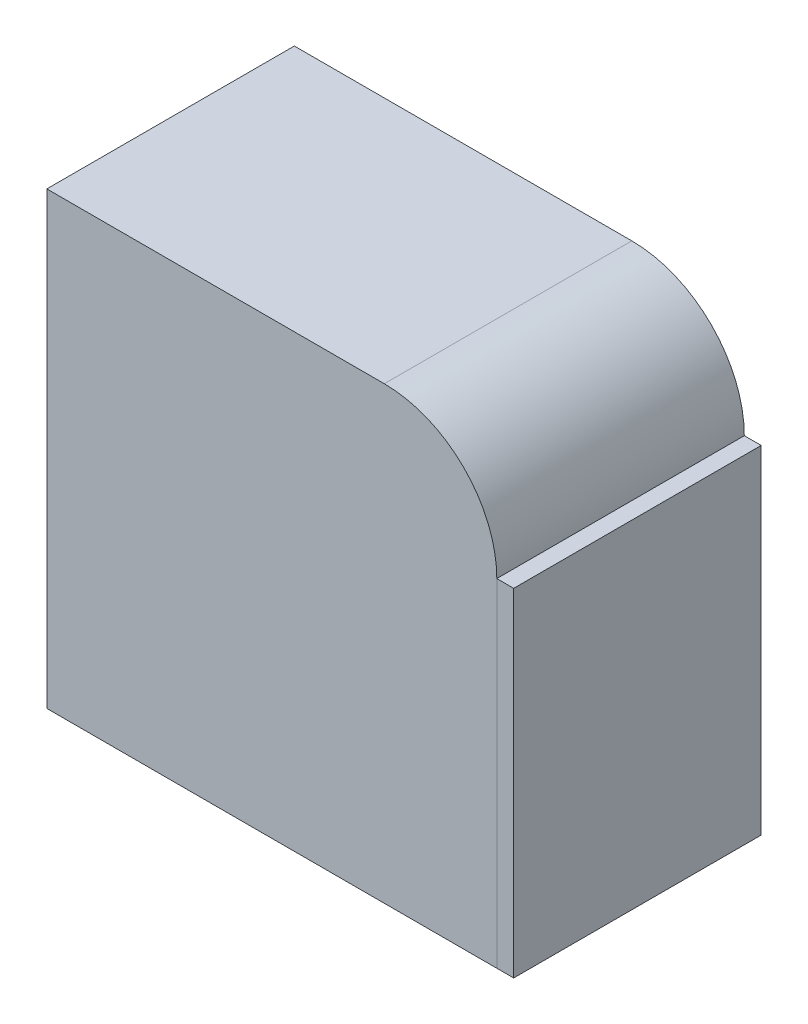
ISO-10303-21;
HEADER;
FILE_DESCRIPTION(('STEP AP214'),'2;1');
FILE_NAME('part.step','',(''),(''),'','','');
FILE_SCHEMA(('AUTOMOTIVE_DESIGN { 1 0 10303 214 1 1 1 1 }'));
ENDSEC;
DATA;
#1=APPLICATION_CONTEXT('core data for automotive mechanical design processes');
#2=APPLICATION_PROTOCOL_DEFINITION('international standard','automotive_design',2000,#1);
#3=PRODUCT_CONTEXT('',#1,'mechanical');
#4=PRODUCT('Part','Part','',(#3));
#5=PRODUCT_RELATED_PRODUCT_CATEGORY('part','',(#4));
#6=PRODUCT_DEFINITION_FORMATION('','',#4);
#7=PRODUCT_DEFINITION_CONTEXT('part definition',#1,'design');
#8=PRODUCT_DEFINITION('design','',#6,#7);
#9=PRODUCT_DEFINITION_SHAPE('','',#8);
#10=(LENGTH_UNIT() NAMED_UNIT(*) SI_UNIT(.MILLI.,.METRE.));
#11=(NAMED_UNIT(*) PLANE_ANGLE_UNIT() SI_UNIT($,.RADIAN.));
#12=(NAMED_UNIT(*) SI_UNIT($,.STERADIAN.) SOLID_ANGLE_UNIT());
#13=UNCERTAINTY_MEASURE_WITH_UNIT(LENGTH_MEASURE(1.E-05),#10,'distance_accuracy_value','');
#14=(GEOMETRIC_REPRESENTATION_CONTEXT(3) GLOBAL_UNCERTAINTY_ASSIGNED_CONTEXT((#13)) GLOBAL_UNIT_ASSIGNED_CONTEXT((#10,
#11,#12)) REPRESENTATION_CONTEXT('',''));
#15=CARTESIAN_POINT('',(0.,0.,0.));
#16=DIRECTION('',(0.,0.,1.));
#17=DIRECTION('',(1.,0.,0.));
#18=AXIS2_PLACEMENT_3D('',#15,#16,#17);
#19=CARTESIAN_POINT('',(-16.5,-55.,11.));
#20=DIRECTION('',(0.,1.,0.));
#21=DIRECTION('',(0.,0.,1.));
#22=AXIS2_PLACEMENT_3D('',#19,#20,#21);
#23=PLANE('',#22);
#24=DIRECTION('',(0.,0.,-1.));
#25=VECTOR('',#24,1.);
#26=CARTESIAN_POINT('',(-18.,-55.,11.));
#27=LINE('',#26,#25);
#28=CARTESIAN_POINT('',(-18.,-55.,11.));
#29=VERTEX_POINT('',#28);
#30=CARTESIAN_POINT('',(-18.,-55.,-11.));
#31=VERTEX_POINT('',#30);
#32=EDGE_CURVE('E112',#29,#31,#27,.T.);
#33=ORIENTED_EDGE('',*,*,#32,.T.);
#34=DIRECTION('',(-1.,0.,0.));
#35=VECTOR('',#34,1.);
#36=CARTESIAN_POINT('',(-16.5,-55.,-11.));
#37=LINE('',#36,#35);
#38=CARTESIAN_POINT('',(-16.5,-55.,-11.));
#39=VERTEX_POINT('',#38);
#40=EDGE_CURVE('E12',#39,#31,#37,.T.);
#41=ORIENTED_EDGE('',*,*,#40,.F.);
#42=DIRECTION('',(0.,0.,-1.));
#43=VECTOR('',#42,1.);
#44=CARTESIAN_POINT('',(-16.5,-55.,11.));
#45=LINE('',#44,#43);
#46=CARTESIAN_POINT('',(-16.5,-55.,11.));
#47=VERTEX_POINT('',#46);
#48=EDGE_CURVE('E100',#47,#39,#45,.T.);
#49=ORIENTED_EDGE('',*,*,#48,.F.);
#50=DIRECTION('',(-1.,0.,0.));
#51=VECTOR('',#50,1.);
#52=CARTESIAN_POINT('',(-16.5,-55.,11.));
#53=LINE('',#52,#51);
#54=EDGE_CURVE('E108',#47,#29,#53,.T.);
#55=ORIENTED_EDGE('',*,*,#54,.T.);
#56=EDGE_LOOP('',(#33,#41,#49,#55));
#57=FACE_BOUND('',#56,.T.);
#58=ADVANCED_FACE('F49',(#57),#23,.F.);
#59=CARTESIAN_POINT('',(-16.5,-55.,-11.));
#60=DIRECTION('',(0.,0.,1.));
#61=DIRECTION('',(1.,0.,0.));
#62=AXIS2_PLACEMENT_3D('',#59,#60,#61);
#63=PLANE('',#62);
#64=DIRECTION('',(0.,1.,0.));
#65=VECTOR('',#64,1.);
#66=CARTESIAN_POINT('',(-18.,-55.,-11.));
#67=LINE('',#66,#65);
#68=CARTESIAN_POINT('',(-18.,-25.,-11.));
#69=VERTEX_POINT('',#68);
#70=EDGE_CURVE('E104',#31,#69,#67,.T.);
#71=ORIENTED_EDGE('',*,*,#70,.T.);
#72=DIRECTION('',(-1.,0.,0.));
#73=VECTOR('',#72,1.);
#74=CARTESIAN_POINT('',(-16.5,-25.,-11.));
#75=LINE('',#74,#73);
#76=CARTESIAN_POINT('',(-16.5,-25.,-11.));
#77=VERTEX_POINT('',#76);
#78=EDGE_CURVE('E57',#77,#69,#75,.T.);
#79=ORIENTED_EDGE('',*,*,#78,.F.);
#80=DIRECTION('',(0.,1.,0.));
#81=VECTOR('',#80,1.);
#82=CARTESIAN_POINT('',(-16.5,-55.,-11.));
#83=LINE('',#82,#81);
#84=EDGE_CURVE('E95',#39,#77,#83,.T.);
#85=ORIENTED_EDGE('',*,*,#84,.F.);
#86=ORIENTED_EDGE('',*,*,#40,.T.);
#87=EDGE_LOOP('',(#71,#79,#85,#86));
#88=FACE_BOUND('',#87,.T.);
#89=ADVANCED_FACE('F103',(#88),#63,.F.);
#90=CARTESIAN_POINT('',(-16.5,-25.,-11.));
#91=DIRECTION('',(0.,-1.,0.));
#92=DIRECTION('',(0.,0.,-1.));
#93=AXIS2_PLACEMENT_3D('',#90,#91,#92);
#94=PLANE('',#93);
#95=DIRECTION('',(0.,0.,1.));
#96=VECTOR('',#95,1.);
#97=CARTESIAN_POINT('',(-18.,-25.,-11.));
#98=LINE('',#97,#96);
#99=CARTESIAN_POINT('',(-18.,-25.,11.));
#100=VERTEX_POINT('',#99);
#101=EDGE_CURVE('E82',#69,#100,#98,.T.);
#102=ORIENTED_EDGE('',*,*,#101,.T.);
#103=DIRECTION('',(-1.,0.,0.));
#104=VECTOR('',#103,1.);
#105=CARTESIAN_POINT('',(-16.5,-25.,11.));
#106=LINE('',#105,#104);
#107=CARTESIAN_POINT('',(-16.5,-25.,11.));
#108=VERTEX_POINT('',#107);
#109=EDGE_CURVE('E105',#108,#100,#106,.T.);
#110=ORIENTED_EDGE('',*,*,#109,.F.);
#111=DIRECTION('',(0.,0.,1.));
#112=VECTOR('',#111,1.);
#113=CARTESIAN_POINT('',(-16.5,-25.,-11.));
#114=LINE('',#113,#112);
#115=EDGE_CURVE('E98',#77,#108,#114,.T.);
#116=ORIENTED_EDGE('',*,*,#115,.F.);
#117=ORIENTED_EDGE('',*,*,#78,.T.);
#118=EDGE_LOOP('',(#102,#110,#116,#117));
#119=FACE_BOUND('',#118,.T.);
#120=ADVANCED_FACE('F106',(#119),#94,.F.);
#121=CARTESIAN_POINT('',(-16.5,-25.,11.));
#122=DIRECTION('',(0.,0.,-1.));
#123=DIRECTION('',(-1.,0.,0.));
#124=AXIS2_PLACEMENT_3D('',#121,#122,#123);
#125=PLANE('',#124);
#126=DIRECTION('',(0.,-1.,0.));
#127=VECTOR('',#126,1.);
#128=CARTESIAN_POINT('',(-18.,-25.,11.));
#129=LINE('',#128,#127);
#130=EDGE_CURVE('E88',#100,#29,#129,.T.);
#131=ORIENTED_EDGE('',*,*,#130,.T.);
#132=ORIENTED_EDGE('',*,*,#54,.F.);
#133=DIRECTION('',(0.,-1.,0.));
#134=VECTOR('',#133,1.);
#135=CARTESIAN_POINT('',(-16.5,-25.,11.));
#136=LINE('',#135,#134);
#137=EDGE_CURVE('E65',#108,#47,#136,.T.);
#138=ORIENTED_EDGE('',*,*,#137,.F.);
#139=ORIENTED_EDGE('',*,*,#109,.T.);
#140=EDGE_LOOP('',(#131,#132,#138,#139));
#141=FACE_BOUND('',#140,.T.);
#142=ADVANCED_FACE('F119',(#141),#125,.F.);
#143=CARTESIAN_POINT('',(-16.5,0.,0.));
#144=DIRECTION('',(1.,0.,0.));
#145=DIRECTION('',(0.,0.,-1.));
#146=AXIS2_PLACEMENT_3D('',#143,#144,#145);
#147=PLANE('',#146);
#148=ORIENTED_EDGE('',*,*,#48,.T.);
#149=ORIENTED_EDGE('',*,*,#84,.T.);
#150=ORIENTED_EDGE('',*,*,#115,.T.);
#151=ORIENTED_EDGE('',*,*,#137,.T.);
#152=EDGE_LOOP('',(#148,#149,#150,#151));
#153=FACE_BOUND('',#152,.T.);
#154=ADVANCED_FACE('F96',(#153),#147,.T.);
#155=CARTESIAN_POINT('',(-18.,0.,0.));
#156=DIRECTION('',(1.,0.,0.));
#157=DIRECTION('',(0.,0.,-1.));
#158=AXIS2_PLACEMENT_3D('',#155,#156,#157);
#159=PLANE('',#158);
#160=ORIENTED_EDGE('',*,*,#32,.F.);
#161=ORIENTED_EDGE('',*,*,#130,.F.);
#162=ORIENTED_EDGE('',*,*,#101,.F.);
#163=ORIENTED_EDGE('',*,*,#70,.F.);
#164=EDGE_LOOP('',(#160,#161,#162,#163));
#165=FACE_BOUND('',#164,.T.);
#166=ADVANCED_FACE('F122',(#165),#159,.F.);
#167=CLOSED_SHELL('',(#58,#89,#120,#142,#154,#166));
#168=MANIFOLD_SOLID_BREP('B2',#167);
#169=CARTESIAN_POINT('',(-58.,-15.,11.));
#170=DIRECTION('',(1.,0.,0.));
#171=DIRECTION('',(0.,1.,0.));
#172=AXIS2_PLACEMENT_3D('',#169,#170,#171);
#173=PLANE('',#172);
#174=DIRECTION('',(0.,-1.,0.));
#175=VECTOR('',#174,1.);
#176=CARTESIAN_POINT('',(-58.,-15.,-11.));
#177=LINE('',#176,#175);
#178=CARTESIAN_POINT('',(-58.,-15.,-11.));
#179=VERTEX_POINT('',#178);
#180=CARTESIAN_POINT('',(-58.,-55.,-11.));
#181=VERTEX_POINT('',#180);
#182=EDGE_CURVE('E247',#179,#181,#177,.T.);
#183=ORIENTED_EDGE('',*,*,#182,.T.);
#184=DIRECTION('',(0.,0.,-1.));
#185=VECTOR('',#184,1.);
#186=CARTESIAN_POINT('',(-58.,-55.,11.));
#187=LINE('',#186,#185);
#188=CARTESIAN_POINT('',(-58.,-55.,11.));
#189=VERTEX_POINT('',#188);
#190=EDGE_CURVE('E47',#189,#181,#187,.T.);
#191=ORIENTED_EDGE('',*,*,#190,.F.);
#192=DIRECTION('',(0.,-1.,0.));
#193=VECTOR('',#192,1.);
#194=CARTESIAN_POINT('',(-58.,-15.,11.));
#195=LINE('',#194,#193);
#196=CARTESIAN_POINT('',(-58.,-15.,11.));
#197=VERTEX_POINT('',#196);
#198=EDGE_CURVE('E255',#197,#189,#195,.T.);
#199=ORIENTED_EDGE('',*,*,#198,.F.);
#200=DIRECTION('',(0.,0.,-1.));
#201=VECTOR('',#200,1.);
#202=CARTESIAN_POINT('',(-58.,-15.,11.));
#203=LINE('',#202,#201);
#204=EDGE_CURVE('E243',#197,#179,#203,.T.);
#205=ORIENTED_EDGE('',*,*,#204,.T.);
#206=EDGE_LOOP('',(#183,#191,#199,#205));
#207=FACE_BOUND('',#206,.T.);
#208=ADVANCED_FACE('F173',(#207),#173,.F.);
#209=CARTESIAN_POINT('',(-58.,-55.,11.));
#210=DIRECTION('',(0.,1.,0.));
#211=DIRECTION('',(0.,0.,1.));
#212=AXIS2_PLACEMENT_3D('',#209,#210,#211);
#213=PLANE('',#212);
#214=DIRECTION('',(1.,0.,0.));
#215=VECTOR('',#214,1.);
#216=CARTESIAN_POINT('',(-58.,-55.,-11.));
#217=LINE('',#216,#215);
#218=CARTESIAN_POINT('',(-18.,-55.,-11.));
#219=VERTEX_POINT('',#218);
#220=EDGE_CURVE('E250',#181,#219,#217,.T.);
#221=ORIENTED_EDGE('',*,*,#220,.T.);
#222=DIRECTION('',(0.,0.,-1.));
#223=VECTOR('',#222,1.);
#224=CARTESIAN_POINT('',(-18.,-55.,11.));
#225=LINE('',#224,#223);
#226=CARTESIAN_POINT('',(-18.,-55.,11.));
#227=VERTEX_POINT('',#226);
#228=EDGE_CURVE('E181',#227,#219,#225,.T.);
#229=ORIENTED_EDGE('',*,*,#228,.F.);
#230=DIRECTION('',(1.,0.,0.));
#231=VECTOR('',#230,1.);
#232=CARTESIAN_POINT('',(-58.,-55.,11.));
#233=LINE('',#232,#231);
#234=EDGE_CURVE('E223',#189,#227,#233,.T.);
#235=ORIENTED_EDGE('',*,*,#234,.F.);
#236=ORIENTED_EDGE('',*,*,#190,.T.);
#237=EDGE_LOOP('',(#221,#229,#235,#236));
#238=FACE_BOUND('',#237,.T.);
#239=ADVANCED_FACE('F274',(#238),#213,.F.);
#240=CARTESIAN_POINT('',(-18.,-25.,11.));
#241=DIRECTION('',(-1.,0.,0.));
#242=DIRECTION('',(0.,0.,1.));
#243=AXIS2_PLACEMENT_3D('',#240,#241,#242);
#244=PLANE('',#243);
#245=DIRECTION('',(0.,1.,0.));
#246=VECTOR('',#245,1.);
#247=CARTESIAN_POINT('',(-18.,-25.,-11.));
#248=LINE('',#247,#246);
#249=CARTESIAN_POINT('',(-18.,-25.,-11.));
#250=VERTEX_POINT('',#249);
#251=EDGE_CURVE('E238',#219,#250,#248,.T.);
#252=ORIENTED_EDGE('',*,*,#251,.T.);
#253=DIRECTION('',(0.,0.,-1.));
#254=VECTOR('',#253,1.);
#255=CARTESIAN_POINT('',(-18.,-25.,11.));
#256=LINE('',#255,#254);
#257=CARTESIAN_POINT('',(-18.,-25.,11.));
#258=VERTEX_POINT('',#257);
#259=EDGE_CURVE('E235',#258,#250,#256,.T.);
#260=ORIENTED_EDGE('',*,*,#259,.F.);
#261=DIRECTION('',(0.,1.,0.));
#262=VECTOR('',#261,1.);
#263=CARTESIAN_POINT('',(-18.,-25.,11.));
#264=LINE('',#263,#262);
#265=EDGE_CURVE('E227',#227,#258,#264,.T.);
#266=ORIENTED_EDGE('',*,*,#265,.F.);
#267=ORIENTED_EDGE('',*,*,#228,.T.);
#268=EDGE_LOOP('',(#252,#260,#266,#267));
#269=FACE_BOUND('',#268,.T.);
#270=ADVANCED_FACE('F236',(#269),#244,.F.);
#271=CARTESIAN_POINT('',(-28.,-25.,11.));
#272=DIRECTION('',(0.,0.,-1.));
#273=DIRECTION('',(-1.,0.,0.));
#274=AXIS2_PLACEMENT_3D('',#271,#272,#273);
#275=CYLINDRICAL_SURFACE('',#274,10.);
#276=CARTESIAN_POINT('',(-28.,-25.,-11.));
#277=DIRECTION('',(0.,0.,1.));
#278=DIRECTION('',(-1.,0.,0.));
#279=AXIS2_PLACEMENT_3D('',#276,#277,#278);
#280=CIRCLE('',#279,10.);
#281=CARTESIAN_POINT('',(-28.,-15.,-11.));
#282=VERTEX_POINT('',#281);
#283=EDGE_CURVE('E209',#250,#282,#280,.T.);
#284=ORIENTED_EDGE('',*,*,#283,.T.);
#285=DIRECTION('',(0.,0.,-1.));
#286=VECTOR('',#285,1.);
#287=CARTESIAN_POINT('',(-28.,-15.,11.));
#288=LINE('',#287,#286);
#289=CARTESIAN_POINT('',(-28.,-15.,11.));
#290=VERTEX_POINT('',#289);
#291=EDGE_CURVE('E239',#290,#282,#288,.T.);
#292=ORIENTED_EDGE('',*,*,#291,.F.);
#293=CARTESIAN_POINT('',(-28.,-25.,11.));
#294=DIRECTION('',(0.,0.,1.));
#295=DIRECTION('',(-1.,0.,0.));
#296=AXIS2_PLACEMENT_3D('',#293,#294,#295);
#297=CIRCLE('',#296,10.);
#298=EDGE_CURVE('E231',#258,#290,#297,.T.);
#299=ORIENTED_EDGE('',*,*,#298,.F.);
#300=ORIENTED_EDGE('',*,*,#259,.T.);
#301=EDGE_LOOP('',(#284,#292,#299,#300));
#302=FACE_BOUND('',#301,.T.);
#303=ADVANCED_FACE('F241',(#302),#275,.T.);
#304=CARTESIAN_POINT('',(-58.,-15.,11.));
#305=DIRECTION('',(0.,-1.,0.));
#306=DIRECTION('',(0.,0.,-1.));
#307=AXIS2_PLACEMENT_3D('',#304,#305,#306);
#308=PLANE('',#307);
#309=DIRECTION('',(-1.,0.,0.));
#310=VECTOR('',#309,1.);
#311=CARTESIAN_POINT('',(-58.,-15.,-11.));
#312=LINE('',#311,#310);
#313=EDGE_CURVE('E215',#282,#179,#312,.T.);
#314=ORIENTED_EDGE('',*,*,#313,.T.);
#315=ORIENTED_EDGE('',*,*,#204,.F.);
#316=DIRECTION('',(-1.,0.,0.));
#317=VECTOR('',#316,1.);
#318=CARTESIAN_POINT('',(-58.,-15.,11.));
#319=LINE('',#318,#317);
#320=EDGE_CURVE('E189',#290,#197,#319,.T.);
#321=ORIENTED_EDGE('',*,*,#320,.F.);
#322=ORIENTED_EDGE('',*,*,#291,.T.);
#323=EDGE_LOOP('',(#314,#315,#321,#322));
#324=FACE_BOUND('',#323,.T.);
#325=ADVANCED_FACE('F263',(#324),#308,.F.);
#326=CARTESIAN_POINT('',(-28.,-25.,11.));
#327=DIRECTION('',(0.,0.,-1.));
#328=DIRECTION('',(-1.,0.,0.));
#329=AXIS2_PLACEMENT_3D('',#326,#327,#328);
#330=PLANE('',#329);
#331=ORIENTED_EDGE('',*,*,#198,.T.);
#332=ORIENTED_EDGE('',*,*,#234,.T.);
#333=ORIENTED_EDGE('',*,*,#265,.T.);
#334=ORIENTED_EDGE('',*,*,#298,.T.);
#335=ORIENTED_EDGE('',*,*,#320,.T.);
#336=EDGE_LOOP('',(#331,#332,#333,#334,#335));
#337=FACE_BOUND('',#336,.T.);
#338=ADVANCED_FACE('F229',(#337),#330,.F.);
#339=CARTESIAN_POINT('',(-28.,-25.,-11.));
#340=DIRECTION('',(0.,0.,-1.));
#341=DIRECTION('',(-1.,0.,0.));
#342=AXIS2_PLACEMENT_3D('',#339,#340,#341);
#343=PLANE('',#342);
#344=ORIENTED_EDGE('',*,*,#182,.F.);
#345=ORIENTED_EDGE('',*,*,#313,.F.);
#346=ORIENTED_EDGE('',*,*,#283,.F.);
#347=ORIENTED_EDGE('',*,*,#251,.F.);
#348=ORIENTED_EDGE('',*,*,#220,.F.);
#349=EDGE_LOOP('',(#344,#345,#346,#347,#348));
#350=FACE_BOUND('',#349,.T.);
#351=ADVANCED_FACE('F259',(#350),#343,.T.);
#352=CLOSED_SHELL('',(#208,#239,#270,#303,#325,#338,#351));
#353=MANIFOLD_SOLID_BREP('B6',#352);
#354=ADVANCED_BREP_SHAPE_REPRESENTATION('',(#18,#168,#353),#14);
#355=SHAPE_DEFINITION_REPRESENTATION(#9,#354);
ENDSEC;
END-ISO-10303-21;
